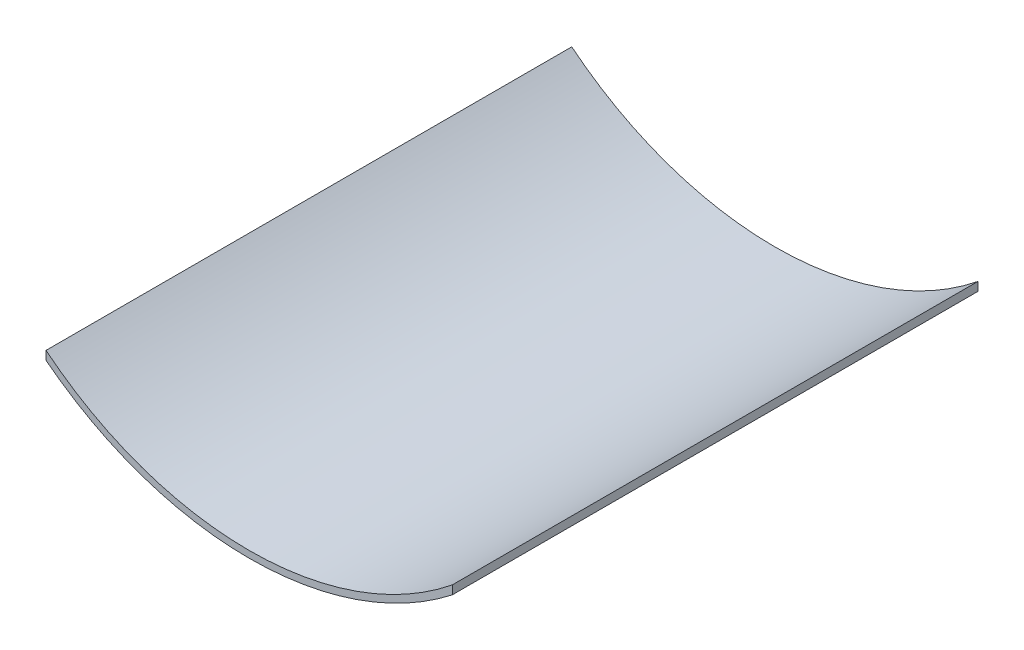
ISO-10303-21;
HEADER;
FILE_DESCRIPTION(('STEP AP214'),'2;1');
FILE_NAME('part.step','',(''),(''),'','','');
FILE_SCHEMA(('AUTOMOTIVE_DESIGN { 1 0 10303 214 1 1 1 1 }'));
ENDSEC;
DATA;
#1=APPLICATION_CONTEXT('core data for automotive mechanical design processes');
#2=APPLICATION_PROTOCOL_DEFINITION('international standard','automotive_design',2000,#1);
#3=PRODUCT_CONTEXT('',#1,'mechanical');
#4=PRODUCT('Part','Part','',(#3));
#5=PRODUCT_RELATED_PRODUCT_CATEGORY('part','',(#4));
#6=PRODUCT_DEFINITION_FORMATION('','',#4);
#7=PRODUCT_DEFINITION_CONTEXT('part definition',#1,'design');
#8=PRODUCT_DEFINITION('design','',#6,#7);
#9=PRODUCT_DEFINITION_SHAPE('','',#8);
#10=(LENGTH_UNIT() NAMED_UNIT(*) SI_UNIT(.MILLI.,.METRE.));
#11=(NAMED_UNIT(*) PLANE_ANGLE_UNIT() SI_UNIT($,.RADIAN.));
#12=(NAMED_UNIT(*) SI_UNIT($,.STERADIAN.) SOLID_ANGLE_UNIT());
#13=UNCERTAINTY_MEASURE_WITH_UNIT(LENGTH_MEASURE(1.E-05),#10,'distance_accuracy_value','');
#14=(GEOMETRIC_REPRESENTATION_CONTEXT(3) GLOBAL_UNCERTAINTY_ASSIGNED_CONTEXT((#13)) GLOBAL_UNIT_ASSIGNED_CONTEXT((#10,
#11,#12)) REPRESENTATION_CONTEXT('',''));
#15=CARTESIAN_POINT('',(0.,0.,0.));
#16=DIRECTION('',(0.,0.,1.));
#17=DIRECTION('',(1.,0.,0.));
#18=AXIS2_PLACEMENT_3D('',#15,#16,#17);
#19=CARTESIAN_POINT('',(-36.401092581861,288.68885277871,440.));
#20=DIRECTION('',(0.,0.,-1.));
#21=DIRECTION('',(-1.,0.,0.));
#22=AXIS2_PLACEMENT_3D('',#19,#20,#21);
#23=CYLINDRICAL_SURFACE('',#22,270.833333333333);
#24=CARTESIAN_POINT('',(-36.401092581861,288.68885277871,0.));
#25=DIRECTION('',(0.,0.,-1.));
#26=DIRECTION('',(1.,0.,0.));
#27=AXIS2_PLACEMENT_3D('',#24,#25,#26);
#28=CIRCLE('',#27,270.833333333333);
#29=CARTESIAN_POINT('',(133.598907418139,77.8555194453766,0.));
#30=VERTEX_POINT('',#29);
#31=CARTESIAN_POINT('',(-206.401092581861,77.8555194453766,0.));
#32=VERTEX_POINT('',#31);
#33=EDGE_CURVE('E113',#30,#32,#28,.T.);
#34=ORIENTED_EDGE('',*,*,#33,.T.);
#35=DIRECTION('',(0.,0.,-1.));
#36=VECTOR('',#35,1.);
#37=CARTESIAN_POINT('',(-206.401092581861,77.8555194453766,440.));
#38=LINE('',#37,#36);
#39=CARTESIAN_POINT('',(-206.401092581861,77.8555194453766,440.));
#40=VERTEX_POINT('',#39);
#41=EDGE_CURVE('E11',#40,#32,#38,.T.);
#42=ORIENTED_EDGE('',*,*,#41,.F.);
#43=CARTESIAN_POINT('',(-36.401092581861,288.68885277871,440.));
#44=DIRECTION('',(0.,0.,-1.));
#45=DIRECTION('',(1.,0.,0.));
#46=AXIS2_PLACEMENT_3D('',#43,#44,#45);
#47=CIRCLE('',#46,270.833333333333);
#48=CARTESIAN_POINT('',(133.598907418139,77.8555194453766,440.));
#49=VERTEX_POINT('',#48);
#50=EDGE_CURVE('E97',#49,#40,#47,.T.);
#51=ORIENTED_EDGE('',*,*,#50,.F.);
#52=DIRECTION('',(0.,0.,-1.));
#53=VECTOR('',#52,1.);
#54=CARTESIAN_POINT('',(133.598907418139,77.8555194453766,440.));
#55=LINE('',#54,#53);
#56=EDGE_CURVE('E109',#49,#30,#55,.T.);
#57=ORIENTED_EDGE('',*,*,#56,.T.);
#58=EDGE_LOOP('',(#34,#42,#51,#57));
#59=FACE_BOUND('',#58,.T.);
#60=ADVANCED_FACE('F45',(#59),#23,.F.);
#61=CARTESIAN_POINT('',(-206.401092581861,77.8555194453766,440.));
#62=DIRECTION('',(1.,0.,0.));
#63=DIRECTION('',(0.,0.,-1.));
#64=AXIS2_PLACEMENT_3D('',#61,#62,#63);
#65=PLANE('',#64);
#66=DIRECTION('',(0.,-1.,0.));
#67=VECTOR('',#66,1.);
#68=CARTESIAN_POINT('',(-206.401092581861,77.8555194453766,0.));
#69=LINE('',#68,#67);
#70=CARTESIAN_POINT('',(-206.401092581861,70.6185023692996,0.));
#71=VERTEX_POINT('',#70);
#72=EDGE_CURVE('E102',#32,#71,#69,.T.);
#73=ORIENTED_EDGE('',*,*,#72,.T.);
#74=DIRECTION('',(0.,0.,-1.));
#75=VECTOR('',#74,1.);
#76=CARTESIAN_POINT('',(-206.401092581861,70.6185023692996,440.));
#77=LINE('',#76,#75);
#78=CARTESIAN_POINT('',(-206.401092581861,70.6185023692996,440.));
#79=VERTEX_POINT('',#78);
#80=EDGE_CURVE('E54',#79,#71,#77,.T.);
#81=ORIENTED_EDGE('',*,*,#80,.F.);
#82=DIRECTION('',(0.,-1.,0.));
#83=VECTOR('',#82,1.);
#84=CARTESIAN_POINT('',(-206.401092581861,77.8555194453766,440.));
#85=LINE('',#84,#83);
#86=EDGE_CURVE('E92',#40,#79,#85,.T.);
#87=ORIENTED_EDGE('',*,*,#86,.F.);
#88=ORIENTED_EDGE('',*,*,#41,.T.);
#89=EDGE_LOOP('',(#73,#81,#87,#88));
#90=FACE_BOUND('',#89,.T.);
#91=ADVANCED_FACE('F101',(#90),#65,.F.);
#92=CARTESIAN_POINT('',(-36.401092581861,288.68885277871,440.));
#93=DIRECTION('',(0.,0.,-1.));
#94=DIRECTION('',(-1.,0.,0.));
#95=AXIS2_PLACEMENT_3D('',#92,#93,#94);
#96=CYLINDRICAL_SURFACE('',#95,276.504390069458);
#97=CARTESIAN_POINT('',(-36.401092581861,288.68885277871,0.));
#98=DIRECTION('',(0.,0.,1.));
#99=DIRECTION('',(1.,0.,0.));
#100=AXIS2_PLACEMENT_3D('',#97,#98,#99);
#101=CIRCLE('',#100,276.504390069458);
#102=CARTESIAN_POINT('',(133.598907418139,70.6185023692995,0.));
#103=VERTEX_POINT('',#102);
#104=EDGE_CURVE('E79',#71,#103,#101,.T.);
#105=ORIENTED_EDGE('',*,*,#104,.T.);
#106=DIRECTION('',(0.,0.,-1.));
#107=VECTOR('',#106,1.);
#108=CARTESIAN_POINT('',(133.598907418139,70.6185023692995,440.));
#109=LINE('',#108,#107);
#110=CARTESIAN_POINT('',(133.598907418139,70.6185023692995,440.));
#111=VERTEX_POINT('',#110);
#112=EDGE_CURVE('E104',#111,#103,#109,.T.);
#113=ORIENTED_EDGE('',*,*,#112,.F.);
#114=CARTESIAN_POINT('',(-36.401092581861,288.68885277871,440.));
#115=DIRECTION('',(0.,0.,1.));
#116=DIRECTION('',(1.,0.,0.));
#117=AXIS2_PLACEMENT_3D('',#114,#115,#116);
#118=CIRCLE('',#117,276.504390069458);
#119=EDGE_CURVE('E95',#79,#111,#118,.T.);
#120=ORIENTED_EDGE('',*,*,#119,.F.);
#121=ORIENTED_EDGE('',*,*,#80,.T.);
#122=EDGE_LOOP('',(#105,#113,#120,#121));
#123=FACE_BOUND('',#122,.T.);
#124=ADVANCED_FACE('F105',(#123),#96,.T.);
#125=CARTESIAN_POINT('',(133.598907418139,77.8555194453766,440.));
#126=DIRECTION('',(-1.,0.,0.));
#127=DIRECTION('',(0.,0.,1.));
#128=AXIS2_PLACEMENT_3D('',#125,#126,#127);
#129=PLANE('',#128);
#130=DIRECTION('',(0.,1.,0.));
#131=VECTOR('',#130,1.);
#132=CARTESIAN_POINT('',(133.598907418139,77.8555194453766,0.));
#133=LINE('',#132,#131);
#134=EDGE_CURVE('E85',#103,#30,#133,.T.);
#135=ORIENTED_EDGE('',*,*,#134,.T.);
#136=ORIENTED_EDGE('',*,*,#56,.F.);
#137=DIRECTION('',(0.,1.,0.));
#138=VECTOR('',#137,1.);
#139=CARTESIAN_POINT('',(133.598907418139,77.8555194453766,440.));
#140=LINE('',#139,#138);
#141=EDGE_CURVE('E62',#111,#49,#140,.T.);
#142=ORIENTED_EDGE('',*,*,#141,.F.);
#143=ORIENTED_EDGE('',*,*,#112,.T.);
#144=EDGE_LOOP('',(#135,#136,#142,#143));
#145=FACE_BOUND('',#144,.T.);
#146=ADVANCED_FACE('F126',(#145),#129,.F.);
#147=CARTESIAN_POINT('',(-36.401092581861,288.68885277871,440.));
#148=DIRECTION('',(0.,0.,1.));
#149=DIRECTION('',(1.,0.,0.));
#150=AXIS2_PLACEMENT_3D('',#147,#148,#149);
#151=PLANE('',#150);
#152=ORIENTED_EDGE('',*,*,#50,.T.);
#153=ORIENTED_EDGE('',*,*,#86,.T.);
#154=ORIENTED_EDGE('',*,*,#119,.T.);
#155=ORIENTED_EDGE('',*,*,#141,.T.);
#156=EDGE_LOOP('',(#152,#153,#154,#155));
#157=FACE_BOUND('',#156,.T.);
#158=ADVANCED_FACE('F93',(#157),#151,.T.);
#159=CARTESIAN_POINT('',(-36.401092581861,288.68885277871,0.));
#160=DIRECTION('',(0.,0.,1.));
#161=DIRECTION('',(1.,0.,0.));
#162=AXIS2_PLACEMENT_3D('',#159,#160,#161);
#163=PLANE('',#162);
#164=ORIENTED_EDGE('',*,*,#33,.F.);
#165=ORIENTED_EDGE('',*,*,#134,.F.);
#166=ORIENTED_EDGE('',*,*,#104,.F.);
#167=ORIENTED_EDGE('',*,*,#72,.F.);
#168=EDGE_LOOP('',(#164,#165,#166,#167));
#169=FACE_BOUND('',#168,.T.);
#170=ADVANCED_FACE('F129',(#169),#163,.F.);
#171=CLOSED_SHELL('',(#60,#91,#124,#146,#158,#170));
#172=MANIFOLD_SOLID_BREP('B2',#171);
#173=ADVANCED_BREP_SHAPE_REPRESENTATION('',(#18,#172),#14);
#174=SHAPE_DEFINITION_REPRESENTATION(#9,#173);
ENDSEC;
END-ISO-10303-21;
